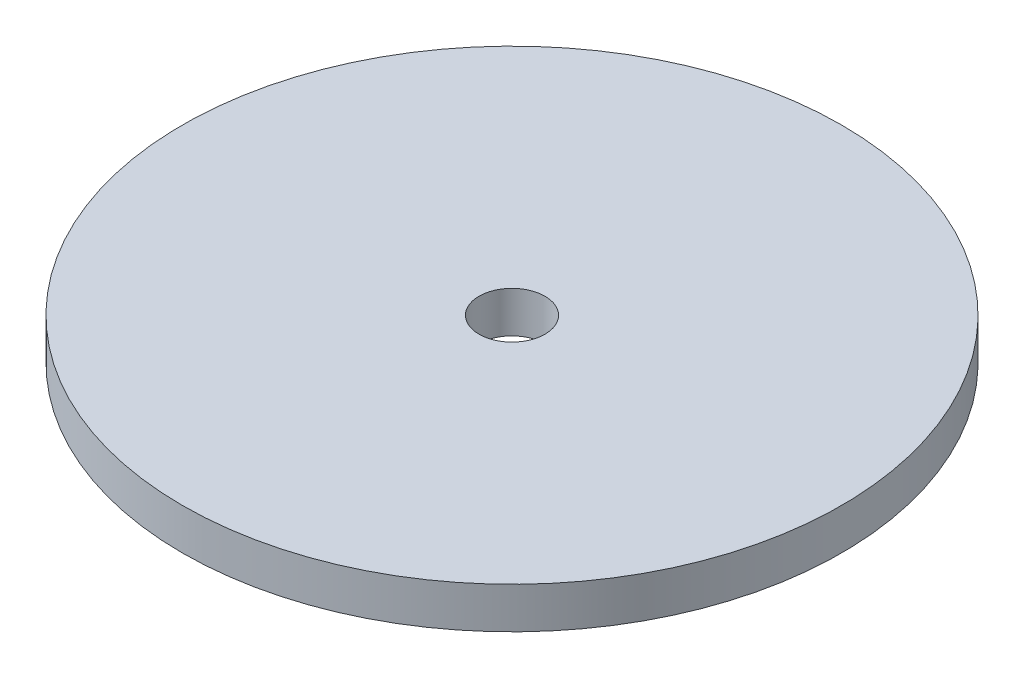
ISO-10303-21;
HEADER;
FILE_DESCRIPTION(('STEP AP214'),'2;1');
FILE_NAME('part.step','',(''),(''),'','','');
FILE_SCHEMA(('AUTOMOTIVE_DESIGN { 1 0 10303 214 1 1 1 1 }'));
ENDSEC;
DATA;
#1=APPLICATION_CONTEXT('core data for automotive mechanical design processes');
#2=APPLICATION_PROTOCOL_DEFINITION('international standard','automotive_design',2000,#1);
#3=PRODUCT_CONTEXT('',#1,'mechanical');
#4=PRODUCT('Part','Part','',(#3));
#5=PRODUCT_RELATED_PRODUCT_CATEGORY('part','',(#4));
#6=PRODUCT_DEFINITION_FORMATION('','',#4);
#7=PRODUCT_DEFINITION_CONTEXT('part definition',#1,'design');
#8=PRODUCT_DEFINITION('design','',#6,#7);
#9=PRODUCT_DEFINITION_SHAPE('','',#8);
#10=(LENGTH_UNIT() NAMED_UNIT(*) SI_UNIT(.MILLI.,.METRE.));
#11=(NAMED_UNIT(*) PLANE_ANGLE_UNIT() SI_UNIT($,.RADIAN.));
#12=(NAMED_UNIT(*) SI_UNIT($,.STERADIAN.) SOLID_ANGLE_UNIT());
#13=UNCERTAINTY_MEASURE_WITH_UNIT(LENGTH_MEASURE(1.E-05),#10,'distance_accuracy_value','');
#14=(GEOMETRIC_REPRESENTATION_CONTEXT(3) GLOBAL_UNCERTAINTY_ASSIGNED_CONTEXT((#13)) GLOBAL_UNIT_ASSIGNED_CONTEXT((#10,
#11,#12)) REPRESENTATION_CONTEXT('',''));
#15=CARTESIAN_POINT('',(0.,0.,0.));
#16=DIRECTION('',(0.,0.,1.));
#17=DIRECTION('',(1.,0.,0.));
#18=AXIS2_PLACEMENT_3D('',#15,#16,#17);
#19=CARTESIAN_POINT('',(0.,3.175,0.));
#20=DIRECTION('',(0.,-1.,0.));
#21=DIRECTION('',(0.,0.,-1.));
#22=AXIS2_PLACEMENT_3D('',#19,#20,#21);
#23=CYLINDRICAL_SURFACE('',#22,25.4);
#24=CARTESIAN_POINT('',(0.,3.175,0.));
#25=DIRECTION('',(0.,1.,0.));
#26=DIRECTION('',(0.,0.,1.));
#27=AXIS2_PLACEMENT_3D('',#24,#25,#26);
#28=CIRCLE('',#27,25.4);
#29=CARTESIAN_POINT('',(0.,3.175,25.4));
#30=VERTEX_POINT('',#29);
#31=EDGE_CURVE('E11',#30,#30,#28,.T.);
#32=ORIENTED_EDGE('',*,*,#31,.F.);
#33=EDGE_LOOP('',(#32));
#34=FACE_BOUND('',#33,.T.);
#35=CARTESIAN_POINT('',(0.,0.,0.));
#36=DIRECTION('',(0.,1.,0.));
#37=DIRECTION('',(0.,0.,1.));
#38=AXIS2_PLACEMENT_3D('',#35,#36,#37);
#39=CIRCLE('',#38,25.4);
#40=CARTESIAN_POINT('',(0.,0.,25.4));
#41=VERTEX_POINT('',#40);
#42=EDGE_CURVE('E47',#41,#41,#39,.T.);
#43=ORIENTED_EDGE('',*,*,#42,.T.);
#44=EDGE_LOOP('',(#43));
#45=FACE_BOUND('',#44,.T.);
#46=ADVANCED_FACE('F44',(#34,#45),#23,.T.);
#47=CARTESIAN_POINT('',(0.,3.175,0.));
#48=DIRECTION('',(0.,1.,0.));
#49=DIRECTION('',(0.,0.,1.));
#50=AXIS2_PLACEMENT_3D('',#47,#48,#49);
#51=PLANE('',#50);
#52=CARTESIAN_POINT('',(0.,3.175,0.));
#53=DIRECTION('',(0.,1.,0.));
#54=DIRECTION('',(0.,0.,1.));
#55=AXIS2_PLACEMENT_3D('',#52,#53,#54);
#56=CIRCLE('',#55,2.54);
#57=CARTESIAN_POINT('',(0.,3.175,2.54));
#58=VERTEX_POINT('',#57);
#59=EDGE_CURVE('E58',#58,#58,#56,.T.);
#60=ORIENTED_EDGE('',*,*,#59,.F.);
#61=EDGE_LOOP('',(#60));
#62=FACE_BOUND('',#61,.T.);
#63=ORIENTED_EDGE('',*,*,#31,.T.);
#64=EDGE_LOOP('',(#63));
#65=FACE_BOUND('',#64,.T.);
#66=ADVANCED_FACE('F76',(#62,#65),#51,.T.);
#67=CARTESIAN_POINT('',(0.,0.,0.));
#68=DIRECTION('',(0.,1.,0.));
#69=DIRECTION('',(0.,0.,1.));
#70=AXIS2_PLACEMENT_3D('',#67,#68,#69);
#71=PLANE('',#70);
#72=CARTESIAN_POINT('',(0.,0.,0.));
#73=DIRECTION('',(0.,1.,0.));
#74=DIRECTION('',(0.,0.,1.));
#75=AXIS2_PLACEMENT_3D('',#72,#73,#74);
#76=CIRCLE('',#75,2.54);
#77=CARTESIAN_POINT('',(0.,0.,2.54));
#78=VERTEX_POINT('',#77);
#79=EDGE_CURVE('E55',#78,#78,#76,.T.);
#80=ORIENTED_EDGE('',*,*,#79,.T.);
#81=EDGE_LOOP('',(#80));
#82=FACE_BOUND('',#81,.T.);
#83=ORIENTED_EDGE('',*,*,#42,.F.);
#84=EDGE_LOOP('',(#83));
#85=FACE_BOUND('',#84,.T.);
#86=ADVANCED_FACE('F67',(#82,#85),#71,.F.);
#87=CARTESIAN_POINT('',(0.,0.,0.));
#88=DIRECTION('',(0.,1.,0.));
#89=DIRECTION('',(0.,0.,1.));
#90=AXIS2_PLACEMENT_3D('',#87,#88,#89);
#91=CYLINDRICAL_SURFACE('',#90,2.54);
#92=ORIENTED_EDGE('',*,*,#79,.F.);
#93=EDGE_LOOP('',(#92));
#94=FACE_BOUND('',#93,.T.);
#95=ORIENTED_EDGE('',*,*,#59,.T.);
#96=EDGE_LOOP('',(#95));
#97=FACE_BOUND('',#96,.T.);
#98=ADVANCED_FACE('F70',(#94,#97),#91,.F.);
#99=CLOSED_SHELL('',(#46,#66,#86,#98));
#100=MANIFOLD_SOLID_BREP('B2',#99);
#101=ADVANCED_BREP_SHAPE_REPRESENTATION('',(#18,#100),#14);
#102=SHAPE_DEFINITION_REPRESENTATION(#9,#101);
ENDSEC;
END-ISO-10303-21;
